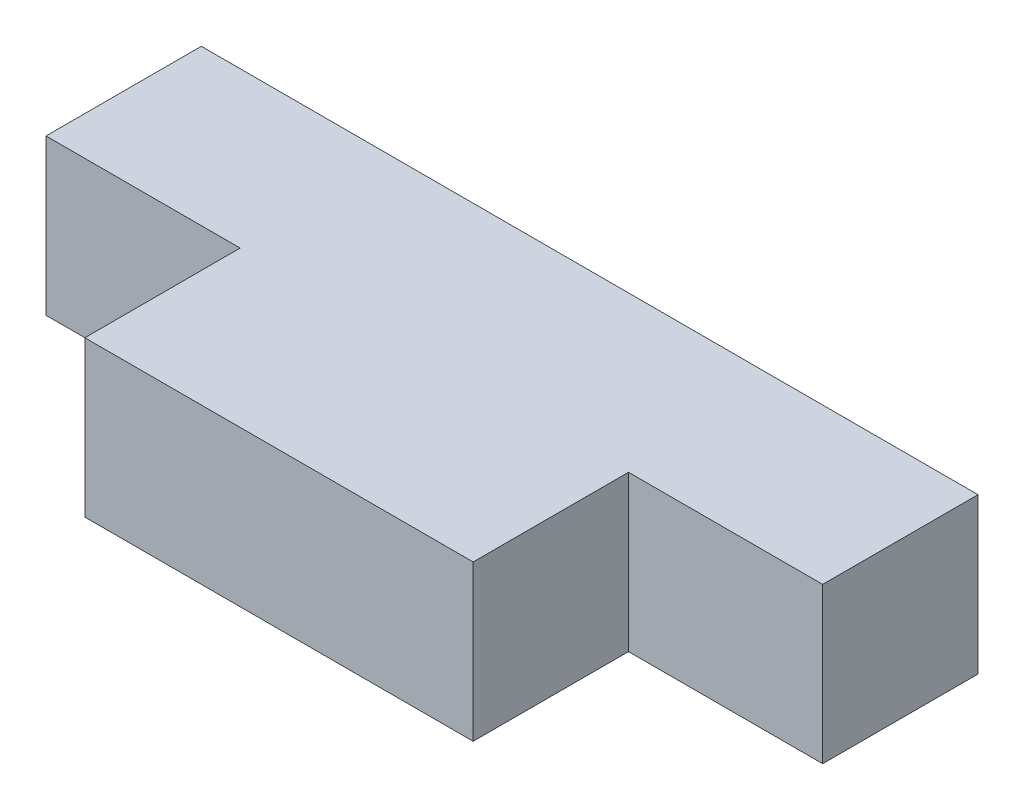
ISO-10303-21;
HEADER;
FILE_DESCRIPTION(('STEP AP214'),'2;1');
FILE_NAME('part.step','',(''),(''),'','','');
FILE_SCHEMA(('AUTOMOTIVE_DESIGN { 1 0 10303 214 1 1 1 1 }'));
ENDSEC;
DATA;
#1=APPLICATION_CONTEXT('core data for automotive mechanical design processes');
#2=APPLICATION_PROTOCOL_DEFINITION('international standard','automotive_design',2000,#1);
#3=PRODUCT_CONTEXT('',#1,'mechanical');
#4=PRODUCT('Part','Part','',(#3));
#5=PRODUCT_RELATED_PRODUCT_CATEGORY('part','',(#4));
#6=PRODUCT_DEFINITION_FORMATION('','',#4);
#7=PRODUCT_DEFINITION_CONTEXT('part definition',#1,'design');
#8=PRODUCT_DEFINITION('design','',#6,#7);
#9=PRODUCT_DEFINITION_SHAPE('','',#8);
#10=(LENGTH_UNIT() NAMED_UNIT(*) SI_UNIT(.MILLI.,.METRE.));
#11=(NAMED_UNIT(*) PLANE_ANGLE_UNIT() SI_UNIT($,.RADIAN.));
#12=(NAMED_UNIT(*) SI_UNIT($,.STERADIAN.) SOLID_ANGLE_UNIT());
#13=UNCERTAINTY_MEASURE_WITH_UNIT(LENGTH_MEASURE(1.E-05),#10,'distance_accuracy_value','');
#14=(GEOMETRIC_REPRESENTATION_CONTEXT(3) GLOBAL_UNCERTAINTY_ASSIGNED_CONTEXT((#13)) GLOBAL_UNIT_ASSIGNED_CONTEXT((#10,
#11,#12)) REPRESENTATION_CONTEXT('',''));
#15=CARTESIAN_POINT('',(0.,0.,0.));
#16=DIRECTION('',(0.,0.,1.));
#17=DIRECTION('',(1.,0.,0.));
#18=AXIS2_PLACEMENT_3D('',#15,#16,#17);
#19=CARTESIAN_POINT('',(-45.1455972610321,6.,-20.807112675098));
#20=DIRECTION('',(1.,0.,0.));
#21=DIRECTION('',(0.,0.,-1.));
#22=AXIS2_PLACEMENT_3D('',#19,#20,#21);
#23=PLANE('',#22);
#24=DIRECTION('',(0.,0.,1.));
#25=VECTOR('',#24,1.);
#26=CARTESIAN_POINT('',(-45.1455972610321,0.,-20.807112675098));
#27=LINE('',#26,#25);
#28=CARTESIAN_POINT('',(-45.1455972610321,0.,-20.807112675098));
#29=VERTEX_POINT('',#28);
#30=CARTESIAN_POINT('',(-45.1455972610321,0.,-14.807112675098));
#31=VERTEX_POINT('',#30);
#32=EDGE_CURVE('E140',#29,#31,#27,.T.);
#33=ORIENTED_EDGE('',*,*,#32,.T.);
#34=DIRECTION('',(0.,-1.,0.));
#35=VECTOR('',#34,1.);
#36=CARTESIAN_POINT('',(-45.1455972610321,6.,-14.807112675098));
#37=LINE('',#36,#35);
#38=CARTESIAN_POINT('',(-45.1455972610321,6.,-14.807112675098));
#39=VERTEX_POINT('',#38);
#40=EDGE_CURVE('E11',#39,#31,#37,.T.);
#41=ORIENTED_EDGE('',*,*,#40,.F.);
#42=DIRECTION('',(0.,0.,1.));
#43=VECTOR('',#42,1.);
#44=CARTESIAN_POINT('',(-45.1455972610321,6.,-20.807112675098));
#45=LINE('',#44,#43);
#46=CARTESIAN_POINT('',(-45.1455972610321,6.,-20.807112675098));
#47=VERTEX_POINT('',#46);
#48=EDGE_CURVE('E162',#47,#39,#45,.T.);
#49=ORIENTED_EDGE('',*,*,#48,.F.);
#50=DIRECTION('',(0.,-1.,0.));
#51=VECTOR('',#50,1.);
#52=CARTESIAN_POINT('',(-45.1455972610321,6.,-20.807112675098));
#53=LINE('',#52,#51);
#54=EDGE_CURVE('E136',#47,#29,#53,.T.);
#55=ORIENTED_EDGE('',*,*,#54,.T.);
#56=EDGE_LOOP('',(#33,#41,#49,#55));
#57=FACE_BOUND('',#56,.T.);
#58=ADVANCED_FACE('F39',(#57),#23,.F.);
#59=CARTESIAN_POINT('',(-45.1455972610321,6.,-14.807112675098));
#60=DIRECTION('',(0.,0.,-1.));
#61=DIRECTION('',(-1.,0.,0.));
#62=AXIS2_PLACEMENT_3D('',#59,#60,#61);
#63=PLANE('',#62);
#64=DIRECTION('',(1.,0.,0.));
#65=VECTOR('',#64,1.);
#66=CARTESIAN_POINT('',(-45.1455972610321,0.,-14.807112675098));
#67=LINE('',#66,#65);
#68=CARTESIAN_POINT('',(-37.6455972610321,0.,-14.807112675098));
#69=VERTEX_POINT('',#68);
#70=EDGE_CURVE('E144',#31,#69,#67,.T.);
#71=ORIENTED_EDGE('',*,*,#70,.T.);
#72=DIRECTION('',(0.,-1.,0.));
#73=VECTOR('',#72,1.);
#74=CARTESIAN_POINT('',(-37.6455972610321,6.,-14.807112675098));
#75=LINE('',#74,#73);
#76=CARTESIAN_POINT('',(-37.6455972610321,6.,-14.807112675098));
#77=VERTEX_POINT('',#76);
#78=EDGE_CURVE('E48',#77,#69,#75,.T.);
#79=ORIENTED_EDGE('',*,*,#78,.F.);
#80=DIRECTION('',(1.,0.,0.));
#81=VECTOR('',#80,1.);
#82=CARTESIAN_POINT('',(-45.1455972610321,6.,-14.807112675098));
#83=LINE('',#82,#81);
#84=EDGE_CURVE('E99',#39,#77,#83,.T.);
#85=ORIENTED_EDGE('',*,*,#84,.F.);
#86=ORIENTED_EDGE('',*,*,#40,.T.);
#87=EDGE_LOOP('',(#71,#79,#85,#86));
#88=FACE_BOUND('',#87,.T.);
#89=ADVANCED_FACE('F208',(#88),#63,.F.);
#90=CARTESIAN_POINT('',(-37.6455972610321,6.,-14.807112675098));
#91=DIRECTION('',(1.,0.,0.));
#92=DIRECTION('',(0.,0.,-1.));
#93=AXIS2_PLACEMENT_3D('',#90,#91,#92);
#94=PLANE('',#93);
#95=DIRECTION('',(0.,0.,1.));
#96=VECTOR('',#95,1.);
#97=CARTESIAN_POINT('',(-37.6455972610321,0.,-14.807112675098));
#98=LINE('',#97,#96);
#99=CARTESIAN_POINT('',(-37.6455972610321,0.,-8.80711267509798));
#100=VERTEX_POINT('',#99);
#101=EDGE_CURVE('E147',#69,#100,#98,.T.);
#102=ORIENTED_EDGE('',*,*,#101,.T.);
#103=DIRECTION('',(0.,-1.,0.));
#104=VECTOR('',#103,1.);
#105=CARTESIAN_POINT('',(-37.6455972610321,6.,-8.80711267509798));
#106=LINE('',#105,#104);
#107=CARTESIAN_POINT('',(-37.6455972610321,6.,-8.80711267509798));
#108=VERTEX_POINT('',#107);
#109=EDGE_CURVE('E173',#108,#100,#106,.T.);
#110=ORIENTED_EDGE('',*,*,#109,.F.);
#111=DIRECTION('',(0.,0.,1.));
#112=VECTOR('',#111,1.);
#113=CARTESIAN_POINT('',(-37.6455972610321,6.,-14.807112675098));
#114=LINE('',#113,#112);
#115=EDGE_CURVE('E183',#77,#108,#114,.T.);
#116=ORIENTED_EDGE('',*,*,#115,.F.);
#117=ORIENTED_EDGE('',*,*,#78,.T.);
#118=EDGE_LOOP('',(#102,#110,#116,#117));
#119=FACE_BOUND('',#118,.T.);
#120=ADVANCED_FACE('F181',(#119),#94,.F.);
#121=CARTESIAN_POINT('',(-37.6455972610321,6.,-8.80711267509798));
#122=DIRECTION('',(0.,0.,-1.));
#123=DIRECTION('',(-1.,0.,0.));
#124=AXIS2_PLACEMENT_3D('',#121,#122,#123);
#125=PLANE('',#124);
#126=DIRECTION('',(1.,0.,0.));
#127=VECTOR('',#126,1.);
#128=CARTESIAN_POINT('',(-37.6455972610321,0.,-8.80711267509798));
#129=LINE('',#128,#127);
#130=CARTESIAN_POINT('',(-22.6455972610321,0.,-8.80711267509798));
#131=VERTEX_POINT('',#130);
#132=EDGE_CURVE('E150',#100,#131,#129,.T.);
#133=ORIENTED_EDGE('',*,*,#132,.T.);
#134=DIRECTION('',(0.,-1.,0.));
#135=VECTOR('',#134,1.);
#136=CARTESIAN_POINT('',(-22.6455972610321,6.,-8.80711267509798));
#137=LINE('',#136,#135);
#138=CARTESIAN_POINT('',(-22.6455972610321,6.,-8.80711267509798));
#139=VERTEX_POINT('',#138);
#140=EDGE_CURVE('E169',#139,#131,#137,.T.);
#141=ORIENTED_EDGE('',*,*,#140,.F.);
#142=DIRECTION('',(1.,0.,0.));
#143=VECTOR('',#142,1.);
#144=CARTESIAN_POINT('',(-37.6455972610321,6.,-8.80711267509798));
#145=LINE('',#144,#143);
#146=EDGE_CURVE('E196',#108,#139,#145,.T.);
#147=ORIENTED_EDGE('',*,*,#146,.F.);
#148=ORIENTED_EDGE('',*,*,#109,.T.);
#149=EDGE_LOOP('',(#133,#141,#147,#148));
#150=FACE_BOUND('',#149,.T.);
#151=ADVANCED_FACE('F191',(#150),#125,.F.);
#152=CARTESIAN_POINT('',(-22.6455972610321,6.,-8.80711267509798));
#153=DIRECTION('',(-1.,0.,0.));
#154=DIRECTION('',(0.,0.,1.));
#155=AXIS2_PLACEMENT_3D('',#152,#153,#154);
#156=PLANE('',#155);
#157=DIRECTION('',(0.,0.,-1.));
#158=VECTOR('',#157,1.);
#159=CARTESIAN_POINT('',(-22.6455972610321,0.,-8.80711267509798));
#160=LINE('',#159,#158);
#161=CARTESIAN_POINT('',(-22.6455972610321,0.,-14.807112675098));
#162=VERTEX_POINT('',#161);
#163=EDGE_CURVE('E153',#131,#162,#160,.T.);
#164=ORIENTED_EDGE('',*,*,#163,.T.);
#165=DIRECTION('',(0.,-1.,0.));
#166=VECTOR('',#165,1.);
#167=CARTESIAN_POINT('',(-22.6455972610321,6.,-14.807112675098));
#168=LINE('',#167,#166);
#169=CARTESIAN_POINT('',(-22.6455972610321,6.,-14.807112675098));
#170=VERTEX_POINT('',#169);
#171=EDGE_CURVE('E129',#170,#162,#168,.T.);
#172=ORIENTED_EDGE('',*,*,#171,.F.);
#173=DIRECTION('',(0.,0.,-1.));
#174=VECTOR('',#173,1.);
#175=CARTESIAN_POINT('',(-22.6455972610321,6.,-8.80711267509798));
#176=LINE('',#175,#174);
#177=EDGE_CURVE('E118',#139,#170,#176,.T.);
#178=ORIENTED_EDGE('',*,*,#177,.F.);
#179=ORIENTED_EDGE('',*,*,#140,.T.);
#180=EDGE_LOOP('',(#164,#172,#178,#179));
#181=FACE_BOUND('',#180,.T.);
#182=ADVANCED_FACE('F194',(#181),#156,.F.);
#183=CARTESIAN_POINT('',(-22.6455972610321,6.,-14.807112675098));
#184=DIRECTION('',(0.,0.,-1.));
#185=DIRECTION('',(-1.,0.,0.));
#186=AXIS2_PLACEMENT_3D('',#183,#184,#185);
#187=PLANE('',#186);
#188=DIRECTION('',(1.,0.,0.));
#189=VECTOR('',#188,1.);
#190=CARTESIAN_POINT('',(-22.6455972610321,0.,-14.807112675098));
#191=LINE('',#190,#189);
#192=CARTESIAN_POINT('',(-15.1455972610321,0.,-14.807112675098));
#193=VERTEX_POINT('',#192);
#194=EDGE_CURVE('E127',#162,#193,#191,.T.);
#195=ORIENTED_EDGE('',*,*,#194,.T.);
#196=DIRECTION('',(0.,-1.,0.));
#197=VECTOR('',#196,1.);
#198=CARTESIAN_POINT('',(-15.1455972610321,6.,-14.807112675098));
#199=LINE('',#198,#197);
#200=CARTESIAN_POINT('',(-15.1455972610321,6.,-14.807112675098));
#201=VERTEX_POINT('',#200);
#202=EDGE_CURVE('E124',#201,#193,#199,.T.);
#203=ORIENTED_EDGE('',*,*,#202,.F.);
#204=DIRECTION('',(1.,0.,0.));
#205=VECTOR('',#204,1.);
#206=CARTESIAN_POINT('',(-22.6455972610321,6.,-14.807112675098));
#207=LINE('',#206,#205);
#208=EDGE_CURVE('E112',#170,#201,#207,.T.);
#209=ORIENTED_EDGE('',*,*,#208,.F.);
#210=ORIENTED_EDGE('',*,*,#171,.T.);
#211=EDGE_LOOP('',(#195,#203,#209,#210));
#212=FACE_BOUND('',#211,.T.);
#213=ADVANCED_FACE('F125',(#212),#187,.F.);
#214=CARTESIAN_POINT('',(-15.1455972610321,6.,-20.807112675098));
#215=DIRECTION('',(-1.,0.,0.));
#216=DIRECTION('',(0.,0.,1.));
#217=AXIS2_PLACEMENT_3D('',#214,#215,#216);
#218=PLANE('',#217);
#219=DIRECTION('',(0.,0.,-1.));
#220=VECTOR('',#219,1.);
#221=CARTESIAN_POINT('',(-15.1455972610321,0.,-20.807112675098));
#222=LINE('',#221,#220);
#223=CARTESIAN_POINT('',(-15.1455972610321,0.,-20.807112675098));
#224=VERTEX_POINT('',#223);
#225=EDGE_CURVE('E85',#193,#224,#222,.T.);
#226=ORIENTED_EDGE('',*,*,#225,.T.);
#227=DIRECTION('',(0.,-1.,0.));
#228=VECTOR('',#227,1.);
#229=CARTESIAN_POINT('',(-15.1455972610321,6.,-20.807112675098));
#230=LINE('',#229,#228);
#231=CARTESIAN_POINT('',(-15.1455972610321,6.,-20.807112675098));
#232=VERTEX_POINT('',#231);
#233=EDGE_CURVE('E130',#232,#224,#230,.T.);
#234=ORIENTED_EDGE('',*,*,#233,.F.);
#235=DIRECTION('',(0.,0.,-1.));
#236=VECTOR('',#235,1.);
#237=CARTESIAN_POINT('',(-15.1455972610321,6.,-20.807112675098));
#238=LINE('',#237,#236);
#239=EDGE_CURVE('E116',#201,#232,#238,.T.);
#240=ORIENTED_EDGE('',*,*,#239,.F.);
#241=ORIENTED_EDGE('',*,*,#202,.T.);
#242=EDGE_LOOP('',(#226,#234,#240,#241));
#243=FACE_BOUND('',#242,.T.);
#244=ADVANCED_FACE('F132',(#243),#218,.F.);
#245=CARTESIAN_POINT('',(-45.1455972610321,6.,-20.807112675098));
#246=DIRECTION('',(0.,0.,1.));
#247=DIRECTION('',(1.,0.,0.));
#248=AXIS2_PLACEMENT_3D('',#245,#246,#247);
#249=PLANE('',#248);
#250=DIRECTION('',(-1.,0.,0.));
#251=VECTOR('',#250,1.);
#252=CARTESIAN_POINT('',(-45.1455972610321,0.,-20.807112675098));
#253=LINE('',#252,#251);
#254=EDGE_CURVE('E91',#224,#29,#253,.T.);
#255=ORIENTED_EDGE('',*,*,#254,.T.);
#256=ORIENTED_EDGE('',*,*,#54,.F.);
#257=DIRECTION('',(-1.,0.,0.));
#258=VECTOR('',#257,1.);
#259=CARTESIAN_POINT('',(-45.1455972610321,6.,-20.807112675098));
#260=LINE('',#259,#258);
#261=EDGE_CURVE('E56',#232,#47,#260,.T.);
#262=ORIENTED_EDGE('',*,*,#261,.F.);
#263=ORIENTED_EDGE('',*,*,#233,.T.);
#264=EDGE_LOOP('',(#255,#256,#262,#263));
#265=FACE_BOUND('',#264,.T.);
#266=ADVANCED_FACE('F224',(#265),#249,.F.);
#267=CARTESIAN_POINT('',(0.,6.,0.));
#268=DIRECTION('',(0.,1.,0.));
#269=DIRECTION('',(0.,0.,1.));
#270=AXIS2_PLACEMENT_3D('',#267,#268,#269);
#271=PLANE('',#270);
#272=ORIENTED_EDGE('',*,*,#48,.T.);
#273=ORIENTED_EDGE('',*,*,#84,.T.);
#274=ORIENTED_EDGE('',*,*,#115,.T.);
#275=ORIENTED_EDGE('',*,*,#146,.T.);
#276=ORIENTED_EDGE('',*,*,#177,.T.);
#277=ORIENTED_EDGE('',*,*,#208,.T.);
#278=ORIENTED_EDGE('',*,*,#239,.T.);
#279=ORIENTED_EDGE('',*,*,#261,.T.);
#280=EDGE_LOOP('',(#272,#273,#274,#275,#276,#277,#278,#279));
#281=FACE_BOUND('',#280,.T.);
#282=ADVANCED_FACE('F114',(#281),#271,.T.);
#283=CARTESIAN_POINT('',(0.,0.,0.));
#284=DIRECTION('',(0.,1.,0.));
#285=DIRECTION('',(0.,0.,1.));
#286=AXIS2_PLACEMENT_3D('',#283,#284,#285);
#287=PLANE('',#286);
#288=ORIENTED_EDGE('',*,*,#32,.F.);
#289=ORIENTED_EDGE('',*,*,#254,.F.);
#290=ORIENTED_EDGE('',*,*,#225,.F.);
#291=ORIENTED_EDGE('',*,*,#194,.F.);
#292=ORIENTED_EDGE('',*,*,#163,.F.);
#293=ORIENTED_EDGE('',*,*,#132,.F.);
#294=ORIENTED_EDGE('',*,*,#101,.F.);
#295=ORIENTED_EDGE('',*,*,#70,.F.);
#296=EDGE_LOOP('',(#288,#289,#290,#291,#292,#293,#294,#295));
#297=FACE_BOUND('',#296,.T.);
#298=ADVANCED_FACE('F187',(#297),#287,.F.);
#299=CLOSED_SHELL('',(#58,#89,#120,#151,#182,#213,#244,#266,#282,#298));
#300=MANIFOLD_SOLID_BREP('B2',#299);
#301=ADVANCED_BREP_SHAPE_REPRESENTATION('',(#18,#300),#14);
#302=SHAPE_DEFINITION_REPRESENTATION(#9,#301);
ENDSEC;
END-ISO-10303-21;
